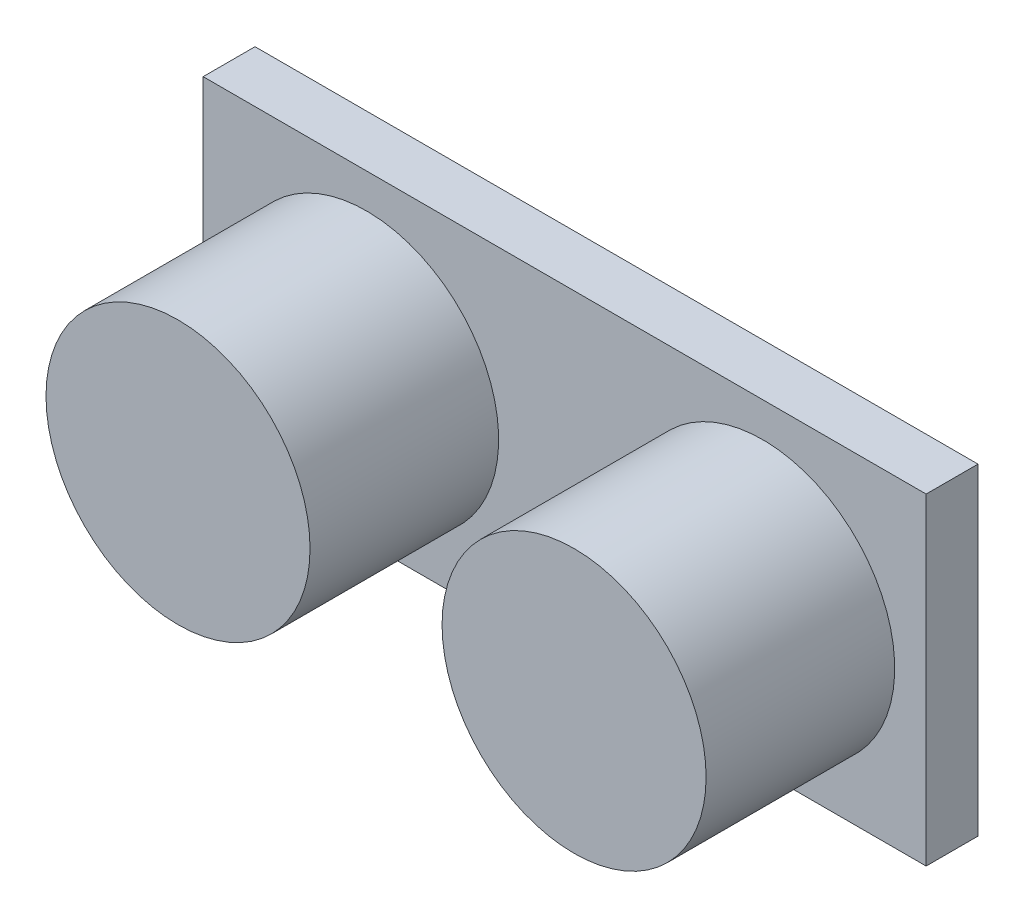
ISO-10303-21;
HEADER;
FILE_DESCRIPTION(('STEP AP214'),'2;1');
FILE_NAME('part.step','',(''),(''),'','','');
FILE_SCHEMA(('AUTOMOTIVE_DESIGN { 1 0 10303 214 1 1 1 1 }'));
ENDSEC;
DATA;
#1=APPLICATION_CONTEXT('core data for automotive mechanical design processes');
#2=APPLICATION_PROTOCOL_DEFINITION('international standard','automotive_design',2000,#1);
#3=PRODUCT_CONTEXT('',#1,'mechanical');
#4=PRODUCT('Part','Part','',(#3));
#5=PRODUCT_RELATED_PRODUCT_CATEGORY('part','',(#4));
#6=PRODUCT_DEFINITION_FORMATION('','',#4);
#7=PRODUCT_DEFINITION_CONTEXT('part definition',#1,'design');
#8=PRODUCT_DEFINITION('design','',#6,#7);
#9=PRODUCT_DEFINITION_SHAPE('','',#8);
#10=(LENGTH_UNIT() NAMED_UNIT(*) SI_UNIT(.MILLI.,.METRE.));
#11=(NAMED_UNIT(*) PLANE_ANGLE_UNIT() SI_UNIT($,.RADIAN.));
#12=(NAMED_UNIT(*) SI_UNIT($,.STERADIAN.) SOLID_ANGLE_UNIT());
#13=UNCERTAINTY_MEASURE_WITH_UNIT(LENGTH_MEASURE(1.E-05),#10,'distance_accuracy_value','');
#14=(GEOMETRIC_REPRESENTATION_CONTEXT(3) GLOBAL_UNCERTAINTY_ASSIGNED_CONTEXT((#13)) GLOBAL_UNIT_ASSIGNED_CONTEXT((#10,
#11,#12)) REPRESENTATION_CONTEXT('',''));
#15=CARTESIAN_POINT('',(0.,0.,0.));
#16=DIRECTION('',(0.,0.,1.));
#17=DIRECTION('',(1.,0.,0.));
#18=AXIS2_PLACEMENT_3D('',#15,#16,#17);
#19=CARTESIAN_POINT('',(23.,-10.25,3.3));
#20=DIRECTION('',(-1.,0.,0.));
#21=DIRECTION('',(0.,0.,1.));
#22=AXIS2_PLACEMENT_3D('',#19,#20,#21);
#23=PLANE('',#22);
#24=DIRECTION('',(0.,1.,0.));
#25=VECTOR('',#24,1.);
#26=CARTESIAN_POINT('',(23.,-10.25,0.));
#27=LINE('',#26,#25);
#28=CARTESIAN_POINT('',(23.,-10.25,0.));
#29=VERTEX_POINT('',#28);
#30=CARTESIAN_POINT('',(23.,10.25,0.));
#31=VERTEX_POINT('',#30);
#32=EDGE_CURVE('E130',#29,#31,#27,.T.);
#33=ORIENTED_EDGE('',*,*,#32,.T.);
#34=DIRECTION('',(0.,0.,-1.));
#35=VECTOR('',#34,1.);
#36=CARTESIAN_POINT('',(23.,10.25,3.3));
#37=LINE('',#36,#35);
#38=CARTESIAN_POINT('',(23.,10.25,3.3));
#39=VERTEX_POINT('',#38);
#40=EDGE_CURVE('E158',#39,#31,#37,.T.);
#41=ORIENTED_EDGE('',*,*,#40,.F.);
#42=DIRECTION('',(0.,1.,0.));
#43=VECTOR('',#42,1.);
#44=CARTESIAN_POINT('',(23.,-10.25,3.3));
#45=LINE('',#44,#43);
#46=CARTESIAN_POINT('',(23.,-10.25,3.3));
#47=VERTEX_POINT('',#46);
#48=EDGE_CURVE('E131',#47,#39,#45,.T.);
#49=ORIENTED_EDGE('',*,*,#48,.F.);
#50=DIRECTION('',(0.,0.,-1.));
#51=VECTOR('',#50,1.);
#52=CARTESIAN_POINT('',(23.,-10.25,3.3));
#53=LINE('',#52,#51);
#54=EDGE_CURVE('E141',#47,#29,#53,.T.);
#55=ORIENTED_EDGE('',*,*,#54,.T.);
#56=EDGE_LOOP('',(#33,#41,#49,#55));
#57=FACE_BOUND('',#56,.T.);
#58=ADVANCED_FACE('F33',(#57),#23,.F.);
#59=CARTESIAN_POINT('',(-23.,10.25,3.3));
#60=DIRECTION('',(0.,-1.,0.));
#61=DIRECTION('',(0.,0.,-1.));
#62=AXIS2_PLACEMENT_3D('',#59,#60,#61);
#63=PLANE('',#62);
#64=DIRECTION('',(-1.,0.,0.));
#65=VECTOR('',#64,1.);
#66=CARTESIAN_POINT('',(-23.,10.25,0.));
#67=LINE('',#66,#65);
#68=CARTESIAN_POINT('',(-23.,10.25,0.));
#69=VERTEX_POINT('',#68);
#70=EDGE_CURVE('E144',#31,#69,#67,.T.);
#71=ORIENTED_EDGE('',*,*,#70,.T.);
#72=DIRECTION('',(0.,0.,-1.));
#73=VECTOR('',#72,1.);
#74=CARTESIAN_POINT('',(-23.,10.25,3.3));
#75=LINE('',#74,#73);
#76=CARTESIAN_POINT('',(-23.,10.25,3.3));
#77=VERTEX_POINT('',#76);
#78=EDGE_CURVE('E155',#77,#69,#75,.T.);
#79=ORIENTED_EDGE('',*,*,#78,.F.);
#80=DIRECTION('',(-1.,0.,0.));
#81=VECTOR('',#80,1.);
#82=CARTESIAN_POINT('',(-23.,10.25,3.3));
#83=LINE('',#82,#81);
#84=EDGE_CURVE('E134',#39,#77,#83,.T.);
#85=ORIENTED_EDGE('',*,*,#84,.F.);
#86=ORIENTED_EDGE('',*,*,#40,.T.);
#87=EDGE_LOOP('',(#71,#79,#85,#86));
#88=FACE_BOUND('',#87,.T.);
#89=ADVANCED_FACE('F179',(#88),#63,.F.);
#90=CARTESIAN_POINT('',(-23.,-10.25,3.3));
#91=DIRECTION('',(1.,0.,0.));
#92=DIRECTION('',(0.,0.,-1.));
#93=AXIS2_PLACEMENT_3D('',#90,#91,#92);
#94=PLANE('',#93);
#95=DIRECTION('',(0.,-1.,0.));
#96=VECTOR('',#95,1.);
#97=CARTESIAN_POINT('',(-23.,-10.25,0.));
#98=LINE('',#97,#96);
#99=CARTESIAN_POINT('',(-23.,-10.25,0.));
#100=VERTEX_POINT('',#99);
#101=EDGE_CURVE('E146',#69,#100,#98,.T.);
#102=ORIENTED_EDGE('',*,*,#101,.T.);
#103=DIRECTION('',(0.,0.,-1.));
#104=VECTOR('',#103,1.);
#105=CARTESIAN_POINT('',(-23.,-10.25,3.3));
#106=LINE('',#105,#104);
#107=CARTESIAN_POINT('',(-23.,-10.25,3.3));
#108=VERTEX_POINT('',#107);
#109=EDGE_CURVE('E152',#108,#100,#106,.T.);
#110=ORIENTED_EDGE('',*,*,#109,.F.);
#111=DIRECTION('',(0.,-1.,0.));
#112=VECTOR('',#111,1.);
#113=CARTESIAN_POINT('',(-23.,-10.25,3.3));
#114=LINE('',#113,#112);
#115=EDGE_CURVE('E137',#77,#108,#114,.T.);
#116=ORIENTED_EDGE('',*,*,#115,.F.);
#117=ORIENTED_EDGE('',*,*,#78,.T.);
#118=EDGE_LOOP('',(#102,#110,#116,#117));
#119=FACE_BOUND('',#118,.T.);
#120=ADVANCED_FACE('F184',(#119),#94,.F.);
#121=CARTESIAN_POINT('',(-23.,-10.25,3.3));
#122=DIRECTION('',(0.,1.,0.));
#123=DIRECTION('',(0.,0.,1.));
#124=AXIS2_PLACEMENT_3D('',#121,#122,#123);
#125=PLANE('',#124);
#126=DIRECTION('',(1.,0.,0.));
#127=VECTOR('',#126,1.);
#128=CARTESIAN_POINT('',(-23.,-10.25,0.));
#129=LINE('',#128,#127);
#130=CARTESIAN_POINT('',(-5.15000000000001,-10.25,0.));
#131=VERTEX_POINT('',#130);
#132=EDGE_CURVE('E135',#100,#131,#129,.T.);
#133=ORIENTED_EDGE('',*,*,#132,.T.);
#134=DIRECTION('',(0.,0.,1.));
#135=VECTOR('',#134,1.);
#136=CARTESIAN_POINT('',(-5.15000000000001,-10.25,-2.));
#137=LINE('',#136,#135);
#138=CARTESIAN_POINT('',(-5.15000000000001,-10.25,-2.));
#139=VERTEX_POINT('',#138);
#140=EDGE_CURVE('E188',#139,#131,#137,.T.);
#141=ORIENTED_EDGE('',*,*,#140,.F.);
#142=DIRECTION('',(-1.,0.,0.));
#143=VECTOR('',#142,1.);
#144=CARTESIAN_POINT('',(5.15,-10.25,-2.));
#145=LINE('',#144,#143);
#146=CARTESIAN_POINT('',(5.15,-10.25,-2.));
#147=VERTEX_POINT('',#146);
#148=EDGE_CURVE('E111',#147,#139,#145,.T.);
#149=ORIENTED_EDGE('',*,*,#148,.F.);
#150=DIRECTION('',(0.,0.,1.));
#151=VECTOR('',#150,1.);
#152=CARTESIAN_POINT('',(5.15,-10.25,-2.));
#153=LINE('',#152,#151);
#154=CARTESIAN_POINT('',(5.15,-10.25,0.));
#155=VERTEX_POINT('',#154);
#156=EDGE_CURVE('E124',#147,#155,#153,.T.);
#157=ORIENTED_EDGE('',*,*,#156,.T.);
#158=EDGE_CURVE('E53',#155,#29,#129,.T.);
#159=ORIENTED_EDGE('',*,*,#158,.T.);
#160=ORIENTED_EDGE('',*,*,#54,.F.);
#161=DIRECTION('',(1.,0.,0.));
#162=VECTOR('',#161,1.);
#163=CARTESIAN_POINT('',(-23.,-10.25,3.3));
#164=LINE('',#163,#162);
#165=EDGE_CURVE('E139',#108,#47,#164,.T.);
#166=ORIENTED_EDGE('',*,*,#165,.F.);
#167=ORIENTED_EDGE('',*,*,#109,.T.);
#168=EDGE_LOOP('',(#133,#141,#149,#157,#159,#160,#166,#167));
#169=FACE_BOUND('',#168,.T.);
#170=ADVANCED_FACE('F169',(#169),#125,.F.);
#171=CARTESIAN_POINT('',(0.,0.,3.3));
#172=DIRECTION('',(0.,0.,-1.));
#173=DIRECTION('',(-1.,0.,0.));
#174=AXIS2_PLACEMENT_3D('',#171,#172,#173);
#175=PLANE('',#174);
#176=CARTESIAN_POINT('',(12.6,-0.349999999999998,3.3));
#177=DIRECTION('',(0.,0.,-1.));
#178=DIRECTION('',(-1.,0.,0.));
#179=AXIS2_PLACEMENT_3D('',#176,#177,#178);
#180=CIRCLE('',#179,8.4);
#181=CARTESIAN_POINT('',(4.2,-0.349999999999998,3.3));
#182=VERTEX_POINT('',#181);
#183=EDGE_CURVE('E11',#182,#182,#180,.F.);
#184=ORIENTED_EDGE('',*,*,#183,.F.);
#185=EDGE_LOOP('',(#184));
#186=FACE_BOUND('',#185,.T.);
#187=CARTESIAN_POINT('',(-12.6,-0.349999999999998,3.3));
#188=DIRECTION('',(0.,0.,-1.));
#189=DIRECTION('',(-1.,0.,0.));
#190=AXIS2_PLACEMENT_3D('',#187,#188,#189);
#191=CIRCLE('',#190,8.4);
#192=CARTESIAN_POINT('',(-21.,-0.349999999999998,3.3));
#193=VERTEX_POINT('',#192);
#194=EDGE_CURVE('E40',#193,#193,#191,.F.);
#195=ORIENTED_EDGE('',*,*,#194,.F.);
#196=EDGE_LOOP('',(#195));
#197=FACE_BOUND('',#196,.T.);
#198=ORIENTED_EDGE('',*,*,#48,.T.);
#199=ORIENTED_EDGE('',*,*,#84,.T.);
#200=ORIENTED_EDGE('',*,*,#115,.T.);
#201=ORIENTED_EDGE('',*,*,#165,.T.);
#202=EDGE_LOOP('',(#198,#199,#200,#201));
#203=FACE_BOUND('',#202,.T.);
#204=ADVANCED_FACE('F165',(#186,#197,#203),#175,.F.);
#205=CARTESIAN_POINT('',(0.,0.,0.));
#206=DIRECTION('',(0.,0.,-1.));
#207=DIRECTION('',(-1.,0.,0.));
#208=AXIS2_PLACEMENT_3D('',#205,#206,#207);
#209=PLANE('',#208);
#210=DIRECTION('',(0.,1.,0.));
#211=VECTOR('',#210,1.);
#212=CARTESIAN_POINT('',(-5.15000000000001,-10.25,0.));
#213=LINE('',#212,#211);
#214=CARTESIAN_POINT('',(-5.15000000000001,-7.70999999999999,0.));
#215=VERTEX_POINT('',#214);
#216=EDGE_CURVE('E118',#131,#215,#213,.T.);
#217=ORIENTED_EDGE('',*,*,#216,.F.);
#218=ORIENTED_EDGE('',*,*,#132,.F.);
#219=ORIENTED_EDGE('',*,*,#101,.F.);
#220=ORIENTED_EDGE('',*,*,#70,.F.);
#221=ORIENTED_EDGE('',*,*,#32,.F.);
#222=ORIENTED_EDGE('',*,*,#158,.F.);
#223=DIRECTION('',(0.,-1.,0.));
#224=VECTOR('',#223,1.);
#225=CARTESIAN_POINT('',(5.15,-10.25,0.));
#226=LINE('',#225,#224);
#227=CARTESIAN_POINT('',(5.15,-7.70999999999999,0.));
#228=VERTEX_POINT('',#227);
#229=EDGE_CURVE('E115',#228,#155,#226,.T.);
#230=ORIENTED_EDGE('',*,*,#229,.F.);
#231=DIRECTION('',(1.,0.,0.));
#232=VECTOR('',#231,1.);
#233=CARTESIAN_POINT('',(5.15,-7.70999999999999,0.));
#234=LINE('',#233,#232);
#235=EDGE_CURVE('E47',#215,#228,#234,.T.);
#236=ORIENTED_EDGE('',*,*,#235,.F.);
#237=EDGE_LOOP('',(#217,#218,#219,#220,#221,#222,#230,#236));
#238=FACE_BOUND('',#237,.T.);
#239=ADVANCED_FACE('F168',(#238),#209,.T.);
#240=CARTESIAN_POINT('',(-12.6,-0.349999999999998,15.3));
#241=DIRECTION('',(0.,0.,-1.));
#242=DIRECTION('',(-1.,0.,0.));
#243=AXIS2_PLACEMENT_3D('',#240,#241,#242);
#244=CYLINDRICAL_SURFACE('',#243,8.4);
#245=CARTESIAN_POINT('',(-12.6,-0.349999999999998,15.3));
#246=DIRECTION('',(0.,0.,1.));
#247=DIRECTION('',(1.,0.,0.));
#248=AXIS2_PLACEMENT_3D('',#245,#246,#247);
#249=CIRCLE('',#248,8.4);
#250=CARTESIAN_POINT('',(-4.2,-0.349999999999998,15.3));
#251=VERTEX_POINT('',#250);
#252=EDGE_CURVE('E122',#251,#251,#249,.T.);
#253=ORIENTED_EDGE('',*,*,#252,.F.);
#254=EDGE_LOOP('',(#253));
#255=FACE_BOUND('',#254,.T.);
#256=ORIENTED_EDGE('',*,*,#194,.T.);
#257=EDGE_LOOP('',(#256));
#258=FACE_BOUND('',#257,.T.);
#259=ADVANCED_FACE('F163',(#255,#258),#244,.T.);
#260=CARTESIAN_POINT('',(-12.6,-0.349999999999998,15.3));
#261=DIRECTION('',(0.,0.,1.));
#262=DIRECTION('',(1.,0.,0.));
#263=AXIS2_PLACEMENT_3D('',#260,#261,#262);
#264=PLANE('',#263);
#265=ORIENTED_EDGE('',*,*,#252,.T.);
#266=EDGE_LOOP('',(#265));
#267=FACE_BOUND('',#266,.T.);
#268=ADVANCED_FACE('F221',(#267),#264,.T.);
#269=CARTESIAN_POINT('',(12.6,-0.349999999999998,15.3));
#270=DIRECTION('',(0.,0.,-1.));
#271=DIRECTION('',(-1.,0.,0.));
#272=AXIS2_PLACEMENT_3D('',#269,#270,#271);
#273=CYLINDRICAL_SURFACE('',#272,8.4);
#274=CARTESIAN_POINT('',(12.6,-0.349999999999998,15.3));
#275=DIRECTION('',(0.,0.,1.));
#276=DIRECTION('',(1.,0.,0.));
#277=AXIS2_PLACEMENT_3D('',#274,#275,#276);
#278=CIRCLE('',#277,8.4);
#279=CARTESIAN_POINT('',(21.,-0.349999999999998,15.3));
#280=VERTEX_POINT('',#279);
#281=EDGE_CURVE('E119',#280,#280,#278,.T.);
#282=ORIENTED_EDGE('',*,*,#281,.F.);
#283=EDGE_LOOP('',(#282));
#284=FACE_BOUND('',#283,.T.);
#285=ORIENTED_EDGE('',*,*,#183,.T.);
#286=EDGE_LOOP('',(#285));
#287=FACE_BOUND('',#286,.T.);
#288=ADVANCED_FACE('F225',(#284,#287),#273,.T.);
#289=CARTESIAN_POINT('',(12.6,-0.349999999999998,15.3));
#290=DIRECTION('',(0.,0.,1.));
#291=DIRECTION('',(1.,0.,0.));
#292=AXIS2_PLACEMENT_3D('',#289,#290,#291);
#293=PLANE('',#292);
#294=ORIENTED_EDGE('',*,*,#281,.T.);
#295=EDGE_LOOP('',(#294));
#296=FACE_BOUND('',#295,.T.);
#297=ADVANCED_FACE('F229',(#296),#293,.T.);
#298=CARTESIAN_POINT('',(-5.15000000000001,-10.25,-2.));
#299=DIRECTION('',(1.,0.,0.));
#300=DIRECTION('',(0.,0.,-1.));
#301=AXIS2_PLACEMENT_3D('',#298,#299,#300);
#302=PLANE('',#301);
#303=ORIENTED_EDGE('',*,*,#216,.T.);
#304=DIRECTION('',(0.,0.,1.));
#305=VECTOR('',#304,1.);
#306=CARTESIAN_POINT('',(-5.15000000000001,-7.70999999999999,-2.));
#307=LINE('',#306,#305);
#308=CARTESIAN_POINT('',(-5.15000000000001,-7.70999999999999,-2.));
#309=VERTEX_POINT('',#308);
#310=EDGE_CURVE('E99',#309,#215,#307,.T.);
#311=ORIENTED_EDGE('',*,*,#310,.F.);
#312=DIRECTION('',(0.,1.,0.));
#313=VECTOR('',#312,1.);
#314=CARTESIAN_POINT('',(-5.15000000000001,-10.25,-2.));
#315=LINE('',#314,#313);
#316=EDGE_CURVE('E106',#139,#309,#315,.T.);
#317=ORIENTED_EDGE('',*,*,#316,.F.);
#318=ORIENTED_EDGE('',*,*,#140,.T.);
#319=EDGE_LOOP('',(#303,#311,#317,#318));
#320=FACE_BOUND('',#319,.T.);
#321=ADVANCED_FACE('F117',(#320),#302,.F.);
#322=CARTESIAN_POINT('',(5.15,-7.70999999999999,-2.));
#323=DIRECTION('',(0.,-1.,0.));
#324=DIRECTION('',(0.,0.,-1.));
#325=AXIS2_PLACEMENT_3D('',#322,#323,#324);
#326=PLANE('',#325);
#327=ORIENTED_EDGE('',*,*,#235,.T.);
#328=DIRECTION('',(0.,0.,1.));
#329=VECTOR('',#328,1.);
#330=CARTESIAN_POINT('',(5.15,-7.70999999999999,-2.));
#331=LINE('',#330,#329);
#332=CARTESIAN_POINT('',(5.15,-7.70999999999999,-2.));
#333=VERTEX_POINT('',#332);
#334=EDGE_CURVE('E102',#333,#228,#331,.T.);
#335=ORIENTED_EDGE('',*,*,#334,.F.);
#336=DIRECTION('',(1.,0.,0.));
#337=VECTOR('',#336,1.);
#338=CARTESIAN_POINT('',(5.15,-7.70999999999999,-2.));
#339=LINE('',#338,#337);
#340=EDGE_CURVE('E95',#309,#333,#339,.T.);
#341=ORIENTED_EDGE('',*,*,#340,.F.);
#342=ORIENTED_EDGE('',*,*,#310,.T.);
#343=EDGE_LOOP('',(#327,#335,#341,#342));
#344=FACE_BOUND('',#343,.T.);
#345=ADVANCED_FACE('F97',(#344),#326,.F.);
#346=CARTESIAN_POINT('',(5.15,-10.25,-2.));
#347=DIRECTION('',(-1.,0.,0.));
#348=DIRECTION('',(0.,0.,1.));
#349=AXIS2_PLACEMENT_3D('',#346,#347,#348);
#350=PLANE('',#349);
#351=ORIENTED_EDGE('',*,*,#229,.T.);
#352=ORIENTED_EDGE('',*,*,#156,.F.);
#353=DIRECTION('',(0.,-1.,0.));
#354=VECTOR('',#353,1.);
#355=CARTESIAN_POINT('',(5.15,-10.25,-2.));
#356=LINE('',#355,#354);
#357=EDGE_CURVE('E105',#333,#147,#356,.T.);
#358=ORIENTED_EDGE('',*,*,#357,.F.);
#359=ORIENTED_EDGE('',*,*,#334,.T.);
#360=EDGE_LOOP('',(#351,#352,#358,#359));
#361=FACE_BOUND('',#360,.T.);
#362=ADVANCED_FACE('F197',(#361),#350,.F.);
#363=CARTESIAN_POINT('',(0.,0.,-2.));
#364=DIRECTION('',(0.,0.,1.));
#365=DIRECTION('',(1.,0.,0.));
#366=AXIS2_PLACEMENT_3D('',#363,#364,#365);
#367=PLANE('',#366);
#368=ORIENTED_EDGE('',*,*,#316,.T.);
#369=ORIENTED_EDGE('',*,*,#340,.T.);
#370=ORIENTED_EDGE('',*,*,#357,.T.);
#371=ORIENTED_EDGE('',*,*,#148,.T.);
#372=EDGE_LOOP('',(#368,#369,#370,#371));
#373=FACE_BOUND('',#372,.T.);
#374=ADVANCED_FACE('F109',(#373),#367,.F.);
#375=CLOSED_SHELL('',(#58,#89,#120,#170,#204,#239,#259,#268,#288,#297,#321,#345,#362,#374));
#376=MANIFOLD_SOLID_BREP('B2',#375);
#377=ADVANCED_BREP_SHAPE_REPRESENTATION('',(#18,#376),#14);
#378=SHAPE_DEFINITION_REPRESENTATION(#9,#377);
ENDSEC;
END-ISO-10303-21;
